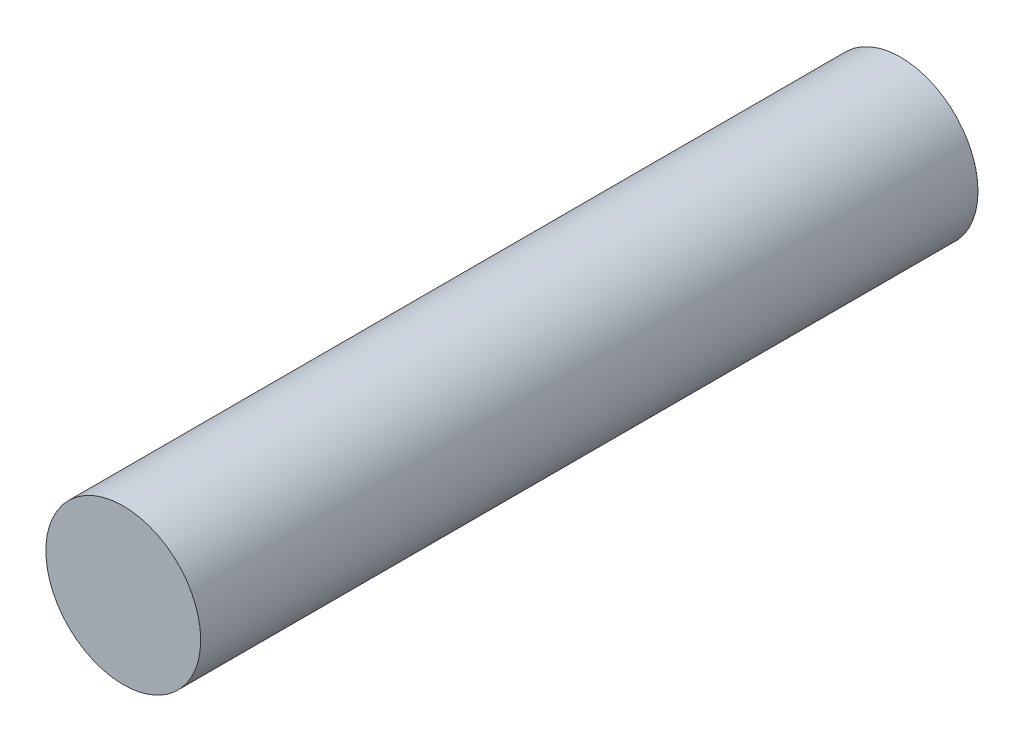
ISO-10303-21;
HEADER;
FILE_DESCRIPTION(('STEP AP214'),'2;1');
FILE_NAME('part.step','',(''),(''),'','','');
FILE_SCHEMA(('AUTOMOTIVE_DESIGN { 1 0 10303 214 1 1 1 1 }'));
ENDSEC;
DATA;
#1=APPLICATION_CONTEXT('core data for automotive mechanical design processes');
#2=APPLICATION_PROTOCOL_DEFINITION('international standard','automotive_design',2000,#1);
#3=PRODUCT_CONTEXT('',#1,'mechanical');
#4=PRODUCT('Part','Part','',(#3));
#5=PRODUCT_RELATED_PRODUCT_CATEGORY('part','',(#4));
#6=PRODUCT_DEFINITION_FORMATION('','',#4);
#7=PRODUCT_DEFINITION_CONTEXT('part definition',#1,'design');
#8=PRODUCT_DEFINITION('design','',#6,#7);
#9=PRODUCT_DEFINITION_SHAPE('','',#8);
#10=(LENGTH_UNIT() NAMED_UNIT(*) SI_UNIT(.MILLI.,.METRE.));
#11=(NAMED_UNIT(*) PLANE_ANGLE_UNIT() SI_UNIT($,.RADIAN.));
#12=(NAMED_UNIT(*) SI_UNIT($,.STERADIAN.) SOLID_ANGLE_UNIT());
#13=UNCERTAINTY_MEASURE_WITH_UNIT(LENGTH_MEASURE(1.E-05),#10,'distance_accuracy_value','');
#14=(GEOMETRIC_REPRESENTATION_CONTEXT(3) GLOBAL_UNCERTAINTY_ASSIGNED_CONTEXT((#13)) GLOBAL_UNIT_ASSIGNED_CONTEXT((#10,
#11,#12)) REPRESENTATION_CONTEXT('',''));
#15=CARTESIAN_POINT('',(0.,0.,0.));
#16=DIRECTION('',(0.,0.,1.));
#17=DIRECTION('',(1.,0.,0.));
#18=AXIS2_PLACEMENT_3D('',#15,#16,#17);
#19=CARTESIAN_POINT('',(0.,0.,-5.));
#20=DIRECTION('',(0.,0.,1.));
#21=DIRECTION('',(1.,0.,0.));
#22=AXIS2_PLACEMENT_3D('',#19,#20,#21);
#23=CYLINDRICAL_SURFACE('',#22,0.508);
#24=CARTESIAN_POINT('',(0.,0.,0.1));
#25=DIRECTION('',(0.,0.,1.));
#26=DIRECTION('',(1.,0.,0.));
#27=AXIS2_PLACEMENT_3D('',#24,#25,#26);
#28=CIRCLE('',#27,0.508);
#29=CARTESIAN_POINT('',(0.508,0.,0.1));
#30=VERTEX_POINT('',#29);
#31=EDGE_CURVE('E10',#30,#30,#28,.T.);
#32=ORIENTED_EDGE('',*,*,#31,.F.);
#33=DIRECTION('',(0.,0.,1.));
#34=VECTOR('',#33,1.);
#35=CARTESIAN_POINT('',(0.508,0.,-5.));
#36=LINE('',#35,#34);
#37=CARTESIAN_POINT('',(0.508,0.,-5.));
#38=VERTEX_POINT('',#37);
#39=EDGE_CURVE('E23',#38,#30,#36,.T.);
#40=ORIENTED_EDGE('',*,*,#39,.F.);
#41=CARTESIAN_POINT('',(0.,0.,-5.));
#42=DIRECTION('',(0.,0.,1.));
#43=DIRECTION('',(1.,0.,0.));
#44=AXIS2_PLACEMENT_3D('',#41,#42,#43);
#45=CIRCLE('',#44,0.508);
#46=EDGE_CURVE('E31',#38,#38,#45,.T.);
#47=ORIENTED_EDGE('',*,*,#46,.T.);
#48=ORIENTED_EDGE('',*,*,#39,.T.);
#49=EDGE_LOOP('',(#32,#40,#47,#48));
#50=FACE_BOUND('',#49,.T.);
#51=ADVANCED_FACE('F16',(#50),#23,.T.);
#52=CARTESIAN_POINT('',(0.,0.,0.1));
#53=DIRECTION('',(0.,0.,1.));
#54=DIRECTION('',(1.,0.,0.));
#55=AXIS2_PLACEMENT_3D('',#52,#53,#54);
#56=PLANE('',#55);
#57=ORIENTED_EDGE('',*,*,#31,.T.);
#58=EDGE_LOOP('',(#57));
#59=FACE_BOUND('',#58,.T.);
#60=ADVANCED_FACE('F34',(#59),#56,.T.);
#61=CARTESIAN_POINT('',(0.,0.,-5.));
#62=DIRECTION('',(0.,0.,1.));
#63=DIRECTION('',(1.,0.,0.));
#64=AXIS2_PLACEMENT_3D('',#61,#62,#63);
#65=PLANE('',#64);
#66=ORIENTED_EDGE('',*,*,#46,.F.);
#67=EDGE_LOOP('',(#66));
#68=FACE_BOUND('',#67,.T.);
#69=ADVANCED_FACE('F36',(#68),#65,.F.);
#70=CLOSED_SHELL('',(#51,#60,#69));
#71=MANIFOLD_SOLID_BREP('B1',#70);
#72=ADVANCED_BREP_SHAPE_REPRESENTATION('',(#18,#71),#14);
#73=SHAPE_DEFINITION_REPRESENTATION(#9,#72);
ENDSEC;
END-ISO-10303-21;
